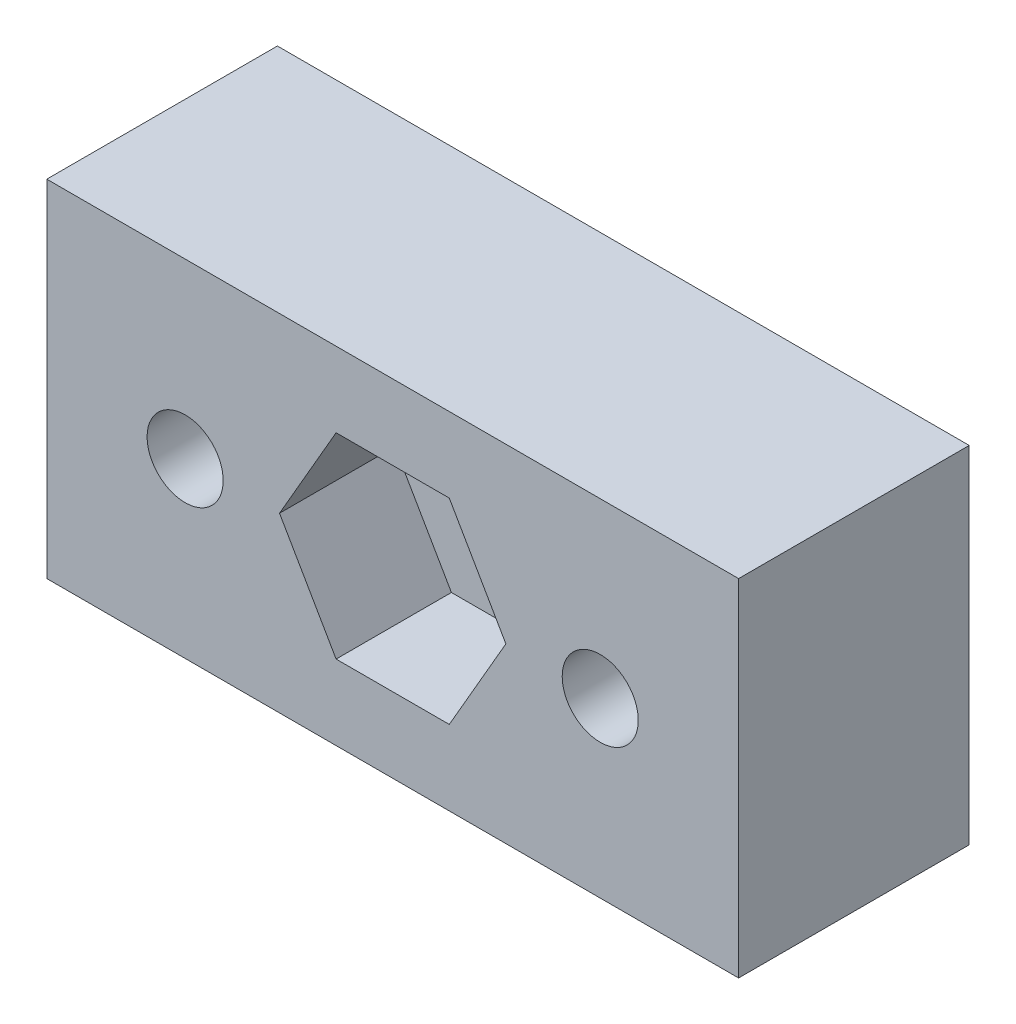
ISO-10303-21;
HEADER;
FILE_DESCRIPTION(('STEP AP214'),'2;1');
FILE_NAME('part.step','',(''),(''),'','','');
FILE_SCHEMA(('AUTOMOTIVE_DESIGN { 1 0 10303 214 1 1 1 1 }'));
ENDSEC;
DATA;
#1=APPLICATION_CONTEXT('core data for automotive mechanical design processes');
#2=APPLICATION_PROTOCOL_DEFINITION('international standard','automotive_design',2000,#1);
#3=PRODUCT_CONTEXT('',#1,'mechanical');
#4=PRODUCT('Part','Part','',(#3));
#5=PRODUCT_RELATED_PRODUCT_CATEGORY('part','',(#4));
#6=PRODUCT_DEFINITION_FORMATION('','',#4);
#7=PRODUCT_DEFINITION_CONTEXT('part definition',#1,'design');
#8=PRODUCT_DEFINITION('design','',#6,#7);
#9=PRODUCT_DEFINITION_SHAPE('','',#8);
#10=(LENGTH_UNIT() NAMED_UNIT(*) SI_UNIT(.MILLI.,.METRE.));
#11=(NAMED_UNIT(*) PLANE_ANGLE_UNIT() SI_UNIT($,.RADIAN.));
#12=(NAMED_UNIT(*) SI_UNIT($,.STERADIAN.) SOLID_ANGLE_UNIT());
#13=UNCERTAINTY_MEASURE_WITH_UNIT(LENGTH_MEASURE(1.E-05),#10,'distance_accuracy_value','');
#14=(GEOMETRIC_REPRESENTATION_CONTEXT(3) GLOBAL_UNCERTAINTY_ASSIGNED_CONTEXT((#13)) GLOBAL_UNIT_ASSIGNED_CONTEXT((#10,
#11,#12)) REPRESENTATION_CONTEXT('',''));
#15=CARTESIAN_POINT('',(0.,0.,0.));
#16=DIRECTION('',(0.,0.,1.));
#17=DIRECTION('',(1.,0.,0.));
#18=AXIS2_PLACEMENT_3D('',#15,#16,#17);
#19=CARTESIAN_POINT('',(0.,0.,10.));
#20=DIRECTION('',(0.,0.,-1.));
#21=DIRECTION('',(-1.,0.,0.));
#22=AXIS2_PLACEMENT_3D('',#19,#20,#21);
#23=PLANE('',#22);
#24=DIRECTION('',(0.,-1.,0.));
#25=VECTOR('',#24,1.);
#26=CARTESIAN_POINT('',(-30.,-15.,10.));
#27=LINE('',#26,#25);
#28=CARTESIAN_POINT('',(-30.,15.,10.));
#29=VERTEX_POINT('',#28);
#30=CARTESIAN_POINT('',(-30.,-15.,10.));
#31=VERTEX_POINT('',#30);
#32=EDGE_CURVE('E208',#29,#31,#27,.T.);
#33=ORIENTED_EDGE('',*,*,#32,.T.);
#34=DIRECTION('',(1.,0.,0.));
#35=VECTOR('',#34,1.);
#36=CARTESIAN_POINT('',(-30.,-15.,10.));
#37=LINE('',#36,#35);
#38=CARTESIAN_POINT('',(30.,-15.,10.));
#39=VERTEX_POINT('',#38);
#40=EDGE_CURVE('E99',#31,#39,#37,.T.);
#41=ORIENTED_EDGE('',*,*,#40,.T.);
#42=DIRECTION('',(0.,1.,0.));
#43=VECTOR('',#42,1.);
#44=CARTESIAN_POINT('',(30.,-15.,10.));
#45=LINE('',#44,#43);
#46=CARTESIAN_POINT('',(30.,15.,10.));
#47=VERTEX_POINT('',#46);
#48=EDGE_CURVE('E213',#39,#47,#45,.T.);
#49=ORIENTED_EDGE('',*,*,#48,.T.);
#50=DIRECTION('',(-1.,0.,0.));
#51=VECTOR('',#50,1.);
#52=CARTESIAN_POINT('',(-30.,15.,10.));
#53=LINE('',#52,#51);
#54=EDGE_CURVE('E71',#47,#29,#53,.T.);
#55=ORIENTED_EDGE('',*,*,#54,.T.);
#56=EDGE_LOOP('',(#33,#41,#49,#55));
#57=FACE_BOUND('',#56,.T.);
#58=CARTESIAN_POINT('',(18.,0.,10.));
#59=DIRECTION('',(0.,0.,-1.));
#60=DIRECTION('',(-1.,0.,0.));
#61=AXIS2_PLACEMENT_3D('',#58,#59,#60);
#62=CIRCLE('',#61,3.3);
#63=CARTESIAN_POINT('',(14.7,0.,10.));
#64=VERTEX_POINT('',#63);
#65=EDGE_CURVE('E203',#64,#64,#62,.T.);
#66=ORIENTED_EDGE('',*,*,#65,.T.);
#67=EDGE_LOOP('',(#66));
#68=FACE_BOUND('',#67,.T.);
#69=CARTESIAN_POINT('',(-18.,0.,10.));
#70=DIRECTION('',(0.,0.,-1.));
#71=DIRECTION('',(-1.,0.,0.));
#72=AXIS2_PLACEMENT_3D('',#69,#70,#71);
#73=CIRCLE('',#72,3.3);
#74=CARTESIAN_POINT('',(-21.3,0.,10.));
#75=VERTEX_POINT('',#74);
#76=EDGE_CURVE('E187',#75,#75,#73,.T.);
#77=ORIENTED_EDGE('',*,*,#76,.T.);
#78=EDGE_LOOP('',(#77));
#79=FACE_BOUND('',#78,.T.);
#80=DIRECTION('',(0.5,0.866025403784438,0.));
#81=VECTOR('',#80,1.);
#82=CARTESIAN_POINT('',(-9.81495457622364,0.,10.));
#83=LINE('',#82,#81);
#84=CARTESIAN_POINT('',(-9.81495457622364,0.,10.));
#85=VERTEX_POINT('',#84);
#86=CARTESIAN_POINT('',(-4.90747728811182,8.5,10.));
#87=VERTEX_POINT('',#86);
#88=EDGE_CURVE('E62',#85,#87,#83,.T.);
#89=ORIENTED_EDGE('',*,*,#88,.T.);
#90=DIRECTION('',(1.,0.,0.));
#91=VECTOR('',#90,1.);
#92=CARTESIAN_POINT('',(-4.90747728811182,8.5,10.));
#93=LINE('',#92,#91);
#94=CARTESIAN_POINT('',(4.90747728811182,8.5,10.));
#95=VERTEX_POINT('',#94);
#96=EDGE_CURVE('E156',#87,#95,#93,.T.);
#97=ORIENTED_EDGE('',*,*,#96,.T.);
#98=DIRECTION('',(0.5,-0.866025403784438,0.));
#99=VECTOR('',#98,1.);
#100=CARTESIAN_POINT('',(4.90747728811182,8.5,10.));
#101=LINE('',#100,#99);
#102=CARTESIAN_POINT('',(9.81495457622364,0.,10.));
#103=VERTEX_POINT('',#102);
#104=EDGE_CURVE('E460',#95,#103,#101,.T.);
#105=ORIENTED_EDGE('',*,*,#104,.T.);
#106=DIRECTION('',(-0.5,-0.866025403784439,0.));
#107=VECTOR('',#106,1.);
#108=CARTESIAN_POINT('',(9.81495457622364,0.,10.));
#109=LINE('',#108,#107);
#110=CARTESIAN_POINT('',(4.90747728811182,-8.5,10.));
#111=VERTEX_POINT('',#110);
#112=EDGE_CURVE('E455',#103,#111,#109,.T.);
#113=ORIENTED_EDGE('',*,*,#112,.T.);
#114=DIRECTION('',(-1.,0.,0.));
#115=VECTOR('',#114,1.);
#116=CARTESIAN_POINT('',(4.90747728811182,-8.5,10.));
#117=LINE('',#116,#115);
#118=CARTESIAN_POINT('',(-4.90747728811182,-8.5,10.));
#119=VERTEX_POINT('',#118);
#120=EDGE_CURVE('E449',#111,#119,#117,.T.);
#121=ORIENTED_EDGE('',*,*,#120,.T.);
#122=DIRECTION('',(-0.5,0.866025403784439,0.));
#123=VECTOR('',#122,1.);
#124=CARTESIAN_POINT('',(-4.90747728811182,-8.5,10.));
#125=LINE('',#124,#123);
#126=EDGE_CURVE('E152',#119,#85,#125,.T.);
#127=ORIENTED_EDGE('',*,*,#126,.T.);
#128=EDGE_LOOP('',(#89,#97,#105,#113,#121,#127));
#129=FACE_BOUND('',#128,.T.);
#130=ADVANCED_FACE('F45',(#57,#68,#79,#129),#23,.F.);
#131=CARTESIAN_POINT('',(-30.,-15.,10.));
#132=DIRECTION('',(1.,0.,0.));
#133=DIRECTION('',(0.,0.,-1.));
#134=AXIS2_PLACEMENT_3D('',#131,#132,#133);
#135=PLANE('',#134);
#136=DIRECTION('',(0.,-1.,0.));
#137=VECTOR('',#136,1.);
#138=CARTESIAN_POINT('',(-30.,-15.,-10.));
#139=LINE('',#138,#137);
#140=CARTESIAN_POINT('',(-30.,15.,-10.));
#141=VERTEX_POINT('',#140);
#142=CARTESIAN_POINT('',(-30.,-15.,-10.));
#143=VERTEX_POINT('',#142);
#144=EDGE_CURVE('E207',#141,#143,#139,.T.);
#145=ORIENTED_EDGE('',*,*,#144,.T.);
#146=DIRECTION('',(0.,0.,-1.));
#147=VECTOR('',#146,1.);
#148=CARTESIAN_POINT('',(-30.,-15.,10.));
#149=LINE('',#148,#147);
#150=EDGE_CURVE('E11',#31,#143,#149,.T.);
#151=ORIENTED_EDGE('',*,*,#150,.F.);
#152=ORIENTED_EDGE('',*,*,#32,.F.);
#153=DIRECTION('',(0.,0.,-1.));
#154=VECTOR('',#153,1.);
#155=CARTESIAN_POINT('',(-30.,15.,10.));
#156=LINE('',#155,#154);
#157=EDGE_CURVE('E218',#29,#141,#156,.T.);
#158=ORIENTED_EDGE('',*,*,#157,.T.);
#159=EDGE_LOOP('',(#145,#151,#152,#158));
#160=FACE_BOUND('',#159,.T.);
#161=ADVANCED_FACE('F47',(#160),#135,.F.);
#162=CARTESIAN_POINT('',(-30.,-15.,10.));
#163=DIRECTION('',(0.,1.,0.));
#164=DIRECTION('',(0.,0.,1.));
#165=AXIS2_PLACEMENT_3D('',#162,#163,#164);
#166=PLANE('',#165);
#167=DIRECTION('',(1.,0.,0.));
#168=VECTOR('',#167,1.);
#169=CARTESIAN_POINT('',(-30.,-15.,-10.));
#170=LINE('',#169,#168);
#171=CARTESIAN_POINT('',(30.,-15.,-10.));
#172=VERTEX_POINT('',#171);
#173=EDGE_CURVE('E222',#143,#172,#170,.T.);
#174=ORIENTED_EDGE('',*,*,#173,.T.);
#175=DIRECTION('',(0.,0.,-1.));
#176=VECTOR('',#175,1.);
#177=CARTESIAN_POINT('',(30.,-15.,10.));
#178=LINE('',#177,#176);
#179=EDGE_CURVE('E55',#39,#172,#178,.T.);
#180=ORIENTED_EDGE('',*,*,#179,.F.);
#181=ORIENTED_EDGE('',*,*,#40,.F.);
#182=ORIENTED_EDGE('',*,*,#150,.T.);
#183=EDGE_LOOP('',(#174,#180,#181,#182));
#184=FACE_BOUND('',#183,.T.);
#185=ADVANCED_FACE('F259',(#184),#166,.F.);
#186=CARTESIAN_POINT('',(30.,-15.,10.));
#187=DIRECTION('',(-1.,0.,0.));
#188=DIRECTION('',(0.,0.,1.));
#189=AXIS2_PLACEMENT_3D('',#186,#187,#188);
#190=PLANE('',#189);
#191=DIRECTION('',(0.,1.,0.));
#192=VECTOR('',#191,1.);
#193=CARTESIAN_POINT('',(30.,-15.,-10.));
#194=LINE('',#193,#192);
#195=CARTESIAN_POINT('',(30.,15.,-10.));
#196=VERTEX_POINT('',#195);
#197=EDGE_CURVE('E225',#172,#196,#194,.T.);
#198=ORIENTED_EDGE('',*,*,#197,.T.);
#199=DIRECTION('',(0.,0.,-1.));
#200=VECTOR('',#199,1.);
#201=CARTESIAN_POINT('',(30.,15.,10.));
#202=LINE('',#201,#200);
#203=EDGE_CURVE('E232',#47,#196,#202,.T.);
#204=ORIENTED_EDGE('',*,*,#203,.F.);
#205=ORIENTED_EDGE('',*,*,#48,.F.);
#206=ORIENTED_EDGE('',*,*,#179,.T.);
#207=EDGE_LOOP('',(#198,#204,#205,#206));
#208=FACE_BOUND('',#207,.T.);
#209=ADVANCED_FACE('F240',(#208),#190,.F.);
#210=CARTESIAN_POINT('',(-30.,15.,10.));
#211=DIRECTION('',(0.,-1.,0.));
#212=DIRECTION('',(0.,0.,-1.));
#213=AXIS2_PLACEMENT_3D('',#210,#211,#212);
#214=PLANE('',#213);
#215=DIRECTION('',(-1.,0.,0.));
#216=VECTOR('',#215,1.);
#217=CARTESIAN_POINT('',(-30.,15.,-10.));
#218=LINE('',#217,#216);
#219=EDGE_CURVE('E92',#196,#141,#218,.T.);
#220=ORIENTED_EDGE('',*,*,#219,.T.);
#221=ORIENTED_EDGE('',*,*,#157,.F.);
#222=ORIENTED_EDGE('',*,*,#54,.F.);
#223=ORIENTED_EDGE('',*,*,#203,.T.);
#224=EDGE_LOOP('',(#220,#221,#222,#223));
#225=FACE_BOUND('',#224,.T.);
#226=ADVANCED_FACE('F248',(#225),#214,.F.);
#227=CARTESIAN_POINT('',(0.,0.,-10.));
#228=DIRECTION('',(0.,0.,-1.));
#229=DIRECTION('',(-1.,0.,0.));
#230=AXIS2_PLACEMENT_3D('',#227,#228,#229);
#231=PLANE('',#230);
#232=CARTESIAN_POINT('',(0.,0.,-10.));
#233=DIRECTION('',(0.,0.,-1.));
#234=DIRECTION('',(-1.,0.,0.));
#235=AXIS2_PLACEMENT_3D('',#232,#233,#234);
#236=CIRCLE('',#235,5.125);
#237=CARTESIAN_POINT('',(-5.125,0.,-10.));
#238=VERTEX_POINT('',#237);
#239=EDGE_CURVE('E163',#238,#238,#236,.T.);
#240=ORIENTED_EDGE('',*,*,#239,.F.);
#241=EDGE_LOOP('',(#240));
#242=FACE_BOUND('',#241,.T.);
#243=CARTESIAN_POINT('',(-18.,0.,-10.));
#244=DIRECTION('',(0.,0.,-1.));
#245=DIRECTION('',(-1.,0.,0.));
#246=AXIS2_PLACEMENT_3D('',#243,#244,#245);
#247=CIRCLE('',#246,5.25);
#248=CARTESIAN_POINT('',(-23.25,0.,-10.));
#249=VERTEX_POINT('',#248);
#250=EDGE_CURVE('E175',#249,#249,#247,.T.);
#251=ORIENTED_EDGE('',*,*,#250,.F.);
#252=EDGE_LOOP('',(#251));
#253=FACE_BOUND('',#252,.T.);
#254=CARTESIAN_POINT('',(18.,0.,-10.));
#255=DIRECTION('',(0.,0.,-1.));
#256=DIRECTION('',(-1.,0.,0.));
#257=AXIS2_PLACEMENT_3D('',#254,#255,#256);
#258=CIRCLE('',#257,5.25);
#259=CARTESIAN_POINT('',(12.75,0.,-10.));
#260=VERTEX_POINT('',#259);
#261=EDGE_CURVE('E191',#260,#260,#258,.T.);
#262=ORIENTED_EDGE('',*,*,#261,.F.);
#263=EDGE_LOOP('',(#262));
#264=FACE_BOUND('',#263,.T.);
#265=ORIENTED_EDGE('',*,*,#144,.F.);
#266=ORIENTED_EDGE('',*,*,#219,.F.);
#267=ORIENTED_EDGE('',*,*,#197,.F.);
#268=ORIENTED_EDGE('',*,*,#173,.F.);
#269=EDGE_LOOP('',(#265,#266,#267,#268));
#270=FACE_BOUND('',#269,.T.);
#271=ADVANCED_FACE('F244',(#242,#253,#264,#270),#231,.T.);
#272=CARTESIAN_POINT('',(18.,0.,-10.));
#273=DIRECTION('',(0.,0.,-1.));
#274=DIRECTION('',(-1.,0.,0.));
#275=AXIS2_PLACEMENT_3D('',#272,#273,#274);
#276=CYLINDRICAL_SURFACE('',#275,3.3);
#277=ORIENTED_EDGE('',*,*,#65,.F.);
#278=EDGE_LOOP('',(#277));
#279=FACE_BOUND('',#278,.T.);
#280=CARTESIAN_POINT('',(18.,0.,-2.5));
#281=DIRECTION('',(0.,0.,-1.));
#282=DIRECTION('',(-1.,0.,0.));
#283=AXIS2_PLACEMENT_3D('',#280,#281,#282);
#284=CIRCLE('',#283,3.3);
#285=CARTESIAN_POINT('',(14.7,0.,-2.5));
#286=VERTEX_POINT('',#285);
#287=EDGE_CURVE('E199',#286,#286,#284,.T.);
#288=ORIENTED_EDGE('',*,*,#287,.T.);
#289=EDGE_LOOP('',(#288));
#290=FACE_BOUND('',#289,.T.);
#291=ADVANCED_FACE('F256',(#279,#290),#276,.F.);
#292=CARTESIAN_POINT('',(21.3,0.,-2.5));
#293=DIRECTION('',(0.,0.,1.));
#294=DIRECTION('',(1.,0.,0.));
#295=AXIS2_PLACEMENT_3D('',#292,#293,#294);
#296=PLANE('',#295);
#297=ORIENTED_EDGE('',*,*,#287,.F.);
#298=EDGE_LOOP('',(#297));
#299=FACE_BOUND('',#298,.T.);
#300=CARTESIAN_POINT('',(18.,0.,-2.5));
#301=DIRECTION('',(0.,0.,-1.));
#302=DIRECTION('',(-1.,0.,0.));
#303=AXIS2_PLACEMENT_3D('',#300,#301,#302);
#304=CIRCLE('',#303,5.25);
#305=CARTESIAN_POINT('',(12.75,0.,-2.5));
#306=VERTEX_POINT('',#305);
#307=EDGE_CURVE('E195',#306,#306,#304,.T.);
#308=ORIENTED_EDGE('',*,*,#307,.T.);
#309=EDGE_LOOP('',(#308));
#310=FACE_BOUND('',#309,.T.);
#311=ADVANCED_FACE('F271',(#299,#310),#296,.F.);
#312=CARTESIAN_POINT('',(18.,0.,-10.));
#313=DIRECTION('',(0.,0.,-1.));
#314=DIRECTION('',(-1.,0.,0.));
#315=AXIS2_PLACEMENT_3D('',#312,#313,#314);
#316=CYLINDRICAL_SURFACE('',#315,5.25);
#317=ORIENTED_EDGE('',*,*,#307,.F.);
#318=EDGE_LOOP('',(#317));
#319=FACE_BOUND('',#318,.T.);
#320=ORIENTED_EDGE('',*,*,#261,.T.);
#321=EDGE_LOOP('',(#320));
#322=FACE_BOUND('',#321,.T.);
#323=ADVANCED_FACE('F275',(#319,#322),#316,.F.);
#324=CARTESIAN_POINT('',(-18.,0.,-10.));
#325=DIRECTION('',(0.,0.,-1.));
#326=DIRECTION('',(-1.,0.,0.));
#327=AXIS2_PLACEMENT_3D('',#324,#325,#326);
#328=CYLINDRICAL_SURFACE('',#327,3.3);
#329=ORIENTED_EDGE('',*,*,#76,.F.);
#330=EDGE_LOOP('',(#329));
#331=FACE_BOUND('',#330,.T.);
#332=CARTESIAN_POINT('',(-18.,0.,-2.5));
#333=DIRECTION('',(0.,0.,-1.));
#334=DIRECTION('',(-1.,0.,0.));
#335=AXIS2_PLACEMENT_3D('',#332,#333,#334);
#336=CIRCLE('',#335,3.3);
#337=CARTESIAN_POINT('',(-21.3,0.,-2.5));
#338=VERTEX_POINT('',#337);
#339=EDGE_CURVE('E183',#338,#338,#336,.T.);
#340=ORIENTED_EDGE('',*,*,#339,.T.);
#341=EDGE_LOOP('',(#340));
#342=FACE_BOUND('',#341,.T.);
#343=ADVANCED_FACE('F279',(#331,#342),#328,.F.);
#344=CARTESIAN_POINT('',(-14.7,0.,-2.5));
#345=DIRECTION('',(0.,0.,1.));
#346=DIRECTION('',(1.,0.,0.));
#347=AXIS2_PLACEMENT_3D('',#344,#345,#346);
#348=PLANE('',#347);
#349=ORIENTED_EDGE('',*,*,#339,.F.);
#350=EDGE_LOOP('',(#349));
#351=FACE_BOUND('',#350,.T.);
#352=CARTESIAN_POINT('',(-18.,0.,-2.5));
#353=DIRECTION('',(0.,0.,-1.));
#354=DIRECTION('',(-1.,0.,0.));
#355=AXIS2_PLACEMENT_3D('',#352,#353,#354);
#356=CIRCLE('',#355,5.25);
#357=CARTESIAN_POINT('',(-23.25,0.,-2.5));
#358=VERTEX_POINT('',#357);
#359=EDGE_CURVE('E179',#358,#358,#356,.T.);
#360=ORIENTED_EDGE('',*,*,#359,.T.);
#361=EDGE_LOOP('',(#360));
#362=FACE_BOUND('',#361,.T.);
#363=ADVANCED_FACE('F283',(#351,#362),#348,.F.);
#364=CARTESIAN_POINT('',(-18.,0.,-10.));
#365=DIRECTION('',(0.,0.,-1.));
#366=DIRECTION('',(-1.,0.,0.));
#367=AXIS2_PLACEMENT_3D('',#364,#365,#366);
#368=CYLINDRICAL_SURFACE('',#367,5.25);
#369=ORIENTED_EDGE('',*,*,#359,.F.);
#370=EDGE_LOOP('',(#369));
#371=FACE_BOUND('',#370,.T.);
#372=ORIENTED_EDGE('',*,*,#250,.T.);
#373=EDGE_LOOP('',(#372));
#374=FACE_BOUND('',#373,.T.);
#375=ADVANCED_FACE('F287',(#371,#374),#368,.F.);
#376=CARTESIAN_POINT('',(0.,0.,-10.));
#377=DIRECTION('',(0.,0.,-1.));
#378=DIRECTION('',(-1.,0.,0.));
#379=AXIS2_PLACEMENT_3D('',#376,#377,#378);
#380=CYLINDRICAL_SURFACE('',#379,5.1);
#381=CARTESIAN_POINT('',(0.,0.,0.));
#382=DIRECTION('',(0.,0.,-1.));
#383=DIRECTION('',(-1.,0.,0.));
#384=AXIS2_PLACEMENT_3D('',#381,#382,#383);
#385=CIRCLE('',#384,5.1);
#386=CARTESIAN_POINT('',(-5.1,0.,0.));
#387=VERTEX_POINT('',#386);
#388=EDGE_CURVE('E49',#387,#387,#385,.F.);
#389=ORIENTED_EDGE('',*,*,#388,.T.);
#390=EDGE_LOOP('',(#389));
#391=FACE_BOUND('',#390,.T.);
#392=CARTESIAN_POINT('',(0.,0.,-9.975));
#393=DIRECTION('',(0.,0.,-1.));
#394=DIRECTION('',(-1.,0.,0.));
#395=AXIS2_PLACEMENT_3D('',#392,#393,#394);
#396=CIRCLE('',#395,5.1);
#397=CARTESIAN_POINT('',(-5.1,0.,-9.975));
#398=VERTEX_POINT('',#397);
#399=EDGE_CURVE('E171',#398,#398,#396,.T.);
#400=ORIENTED_EDGE('',*,*,#399,.T.);
#401=EDGE_LOOP('',(#400));
#402=FACE_BOUND('',#401,.T.);
#403=ADVANCED_FACE('F291',(#391,#402),#380,.F.);
#404=CARTESIAN_POINT('',(0.,0.,-10.));
#405=DIRECTION('',(0.,0.,-1.));
#406=DIRECTION('',(-1.,0.,0.));
#407=AXIS2_PLACEMENT_3D('',#404,#405,#406);
#408=CONICAL_SURFACE('',#407,5.125,0.785398163397518);
#409=ORIENTED_EDGE('',*,*,#399,.F.);
#410=EDGE_LOOP('',(#409));
#411=FACE_BOUND('',#410,.T.);
#412=ORIENTED_EDGE('',*,*,#239,.T.);
#413=EDGE_LOOP('',(#412));
#414=FACE_BOUND('',#413,.T.);
#415=ADVANCED_FACE('F294',(#411,#414),#408,.F.);
#416=CARTESIAN_POINT('',(0.,0.,0.));
#417=DIRECTION('',(0.,0.,-1.));
#418=DIRECTION('',(-1.,0.,0.));
#419=AXIS2_PLACEMENT_3D('',#416,#417,#418);
#420=PLANE('',#419);
#421=DIRECTION('',(0.5,0.866025403784438,0.));
#422=VECTOR('',#421,1.);
#423=CARTESIAN_POINT('',(-9.81495457622364,0.,0.));
#424=LINE('',#423,#422);
#425=CARTESIAN_POINT('',(-9.81495457622364,0.,0.));
#426=VERTEX_POINT('',#425);
#427=CARTESIAN_POINT('',(-4.90747728811182,8.5,0.));
#428=VERTEX_POINT('',#427);
#429=EDGE_CURVE('E140',#426,#428,#424,.T.);
#430=ORIENTED_EDGE('',*,*,#429,.F.);
#431=DIRECTION('',(-0.5,0.866025403784439,0.));
#432=VECTOR('',#431,1.);
#433=CARTESIAN_POINT('',(-4.90747728811182,-8.5,0.));
#434=LINE('',#433,#432);
#435=CARTESIAN_POINT('',(-4.90747728811182,-8.5,0.));
#436=VERTEX_POINT('',#435);
#437=EDGE_CURVE('E466',#436,#426,#434,.T.);
#438=ORIENTED_EDGE('',*,*,#437,.F.);
#439=DIRECTION('',(-1.,0.,0.));
#440=VECTOR('',#439,1.);
#441=CARTESIAN_POINT('',(4.90747728811182,-8.5,0.));
#442=LINE('',#441,#440);
#443=CARTESIAN_POINT('',(4.90747728811182,-8.5,0.));
#444=VERTEX_POINT('',#443);
#445=EDGE_CURVE('E482',#444,#436,#442,.T.);
#446=ORIENTED_EDGE('',*,*,#445,.F.);
#447=DIRECTION('',(-0.5,-0.866025403784439,0.));
#448=VECTOR('',#447,1.);
#449=CARTESIAN_POINT('',(9.81495457622364,0.,0.));
#450=LINE('',#449,#448);
#451=CARTESIAN_POINT('',(9.81495457622364,0.,0.));
#452=VERTEX_POINT('',#451);
#453=EDGE_CURVE('E485',#452,#444,#450,.T.);
#454=ORIENTED_EDGE('',*,*,#453,.F.);
#455=DIRECTION('',(0.5,-0.866025403784438,0.));
#456=VECTOR('',#455,1.);
#457=CARTESIAN_POINT('',(4.90747728811182,8.5,0.));
#458=LINE('',#457,#456);
#459=CARTESIAN_POINT('',(4.90747728811182,8.5,0.));
#460=VERTEX_POINT('',#459);
#461=EDGE_CURVE('E142',#460,#452,#458,.T.);
#462=ORIENTED_EDGE('',*,*,#461,.F.);
#463=DIRECTION('',(1.,0.,0.));
#464=VECTOR('',#463,1.);
#465=CARTESIAN_POINT('',(-4.90747728811182,8.5,0.));
#466=LINE('',#465,#464);
#467=EDGE_CURVE('E135',#428,#460,#466,.T.);
#468=ORIENTED_EDGE('',*,*,#467,.F.);
#469=EDGE_LOOP('',(#430,#438,#446,#454,#462,#468));
#470=FACE_BOUND('',#469,.T.);
#471=ORIENTED_EDGE('',*,*,#388,.F.);
#472=EDGE_LOOP('',(#471));
#473=FACE_BOUND('',#472,.T.);
#474=ADVANCED_FACE('F137',(#470,#473),#420,.F.);
#475=CARTESIAN_POINT('',(-9.81495457622364,0.,0.));
#476=DIRECTION('',(0.866025403784438,-0.5,0.));
#477=DIRECTION('',(0.5,0.866025403784439,0.));
#478=AXIS2_PLACEMENT_3D('',#475,#476,#477);
#479=PLANE('',#478);
#480=ORIENTED_EDGE('',*,*,#88,.F.);
#481=DIRECTION('',(0.,0.,1.));
#482=VECTOR('',#481,1.);
#483=CARTESIAN_POINT('',(-9.81495457622364,0.,0.));
#484=LINE('',#483,#482);
#485=EDGE_CURVE('E150',#426,#85,#484,.T.);
#486=ORIENTED_EDGE('',*,*,#485,.F.);
#487=ORIENTED_EDGE('',*,*,#429,.T.);
#488=DIRECTION('',(0.,0.,1.));
#489=VECTOR('',#488,1.);
#490=CARTESIAN_POINT('',(-4.90747728811182,8.5,0.));
#491=LINE('',#490,#489);
#492=EDGE_CURVE('E149',#428,#87,#491,.T.);
#493=ORIENTED_EDGE('',*,*,#492,.T.);
#494=EDGE_LOOP('',(#480,#486,#487,#493));
#495=FACE_BOUND('',#494,.T.);
#496=ADVANCED_FACE('F148',(#495),#479,.T.);
#497=CARTESIAN_POINT('',(-4.90747728811182,8.5,0.));
#498=DIRECTION('',(0.,-1.,0.));
#499=DIRECTION('',(0.,0.,-1.));
#500=AXIS2_PLACEMENT_3D('',#497,#498,#499);
#501=PLANE('',#500);
#502=ORIENTED_EDGE('',*,*,#96,.F.);
#503=ORIENTED_EDGE('',*,*,#492,.F.);
#504=ORIENTED_EDGE('',*,*,#467,.T.);
#505=DIRECTION('',(0.,0.,1.));
#506=VECTOR('',#505,1.);
#507=CARTESIAN_POINT('',(4.90747728811182,8.5,0.));
#508=LINE('',#507,#506);
#509=EDGE_CURVE('E158',#460,#95,#508,.T.);
#510=ORIENTED_EDGE('',*,*,#509,.T.);
#511=EDGE_LOOP('',(#502,#503,#504,#510));
#512=FACE_BOUND('',#511,.T.);
#513=ADVANCED_FACE('F154',(#512),#501,.T.);
#514=CARTESIAN_POINT('',(4.90747728811182,8.5,0.));
#515=DIRECTION('',(-0.866025403784439,-0.5,0.));
#516=DIRECTION('',(0.5,-0.866025403784439,0.));
#517=AXIS2_PLACEMENT_3D('',#514,#515,#516);
#518=PLANE('',#517);
#519=ORIENTED_EDGE('',*,*,#104,.F.);
#520=ORIENTED_EDGE('',*,*,#509,.F.);
#521=ORIENTED_EDGE('',*,*,#461,.T.);
#522=DIRECTION('',(0.,0.,1.));
#523=VECTOR('',#522,1.);
#524=CARTESIAN_POINT('',(9.81495457622364,0.,0.));
#525=LINE('',#524,#523);
#526=EDGE_CURVE('E164',#452,#103,#525,.T.);
#527=ORIENTED_EDGE('',*,*,#526,.T.);
#528=EDGE_LOOP('',(#519,#520,#521,#527));
#529=FACE_BOUND('',#528,.T.);
#530=ADVANCED_FACE('F302',(#529),#518,.T.);
#531=CARTESIAN_POINT('',(9.81495457622364,0.,0.));
#532=DIRECTION('',(-0.866025403784439,0.5,0.));
#533=DIRECTION('',(-0.5,-0.866025403784439,0.));
#534=AXIS2_PLACEMENT_3D('',#531,#532,#533);
#535=PLANE('',#534);
#536=ORIENTED_EDGE('',*,*,#112,.F.);
#537=ORIENTED_EDGE('',*,*,#526,.F.);
#538=ORIENTED_EDGE('',*,*,#453,.T.);
#539=DIRECTION('',(0.,0.,1.));
#540=VECTOR('',#539,1.);
#541=CARTESIAN_POINT('',(4.90747728811182,-8.5,0.));
#542=LINE('',#541,#540);
#543=EDGE_CURVE('E469',#444,#111,#542,.T.);
#544=ORIENTED_EDGE('',*,*,#543,.T.);
#545=EDGE_LOOP('',(#536,#537,#538,#544));
#546=FACE_BOUND('',#545,.T.);
#547=ADVANCED_FACE('F305',(#546),#535,.T.);
#548=CARTESIAN_POINT('',(4.90747728811182,-8.5,0.));
#549=DIRECTION('',(0.,1.,0.));
#550=DIRECTION('',(0.,0.,1.));
#551=AXIS2_PLACEMENT_3D('',#548,#549,#550);
#552=PLANE('',#551);
#553=ORIENTED_EDGE('',*,*,#120,.F.);
#554=ORIENTED_EDGE('',*,*,#543,.F.);
#555=ORIENTED_EDGE('',*,*,#445,.T.);
#556=DIRECTION('',(0.,0.,1.));
#557=VECTOR('',#556,1.);
#558=CARTESIAN_POINT('',(-4.90747728811182,-8.5,0.));
#559=LINE('',#558,#557);
#560=EDGE_CURVE('E446',#436,#119,#559,.T.);
#561=ORIENTED_EDGE('',*,*,#560,.T.);
#562=EDGE_LOOP('',(#553,#554,#555,#561));
#563=FACE_BOUND('',#562,.T.);
#564=ADVANCED_FACE('F309',(#563),#552,.T.);
#565=CARTESIAN_POINT('',(-4.90747728811182,-8.5,0.));
#566=DIRECTION('',(0.866025403784438,0.5,0.));
#567=DIRECTION('',(-0.5,0.866025403784439,0.));
#568=AXIS2_PLACEMENT_3D('',#565,#566,#567);
#569=PLANE('',#568);
#570=ORIENTED_EDGE('',*,*,#126,.F.);
#571=ORIENTED_EDGE('',*,*,#560,.F.);
#572=ORIENTED_EDGE('',*,*,#437,.T.);
#573=ORIENTED_EDGE('',*,*,#485,.T.);
#574=EDGE_LOOP('',(#570,#571,#572,#573));
#575=FACE_BOUND('',#574,.T.);
#576=ADVANCED_FACE('F313',(#575),#569,.T.);
#577=CLOSED_SHELL('',(#130,#161,#185,#209,#226,#271,#291,#311,#323,#343,#363,#375,#403,#415,
#474,#496,#513,#530,#547,#564,#576));
#578=MANIFOLD_SOLID_BREP('B2',#577);
#579=ADVANCED_BREP_SHAPE_REPRESENTATION('',(#18,#578),#14);
#580=SHAPE_DEFINITION_REPRESENTATION(#9,#579);
ENDSEC;
END-ISO-10303-21;
